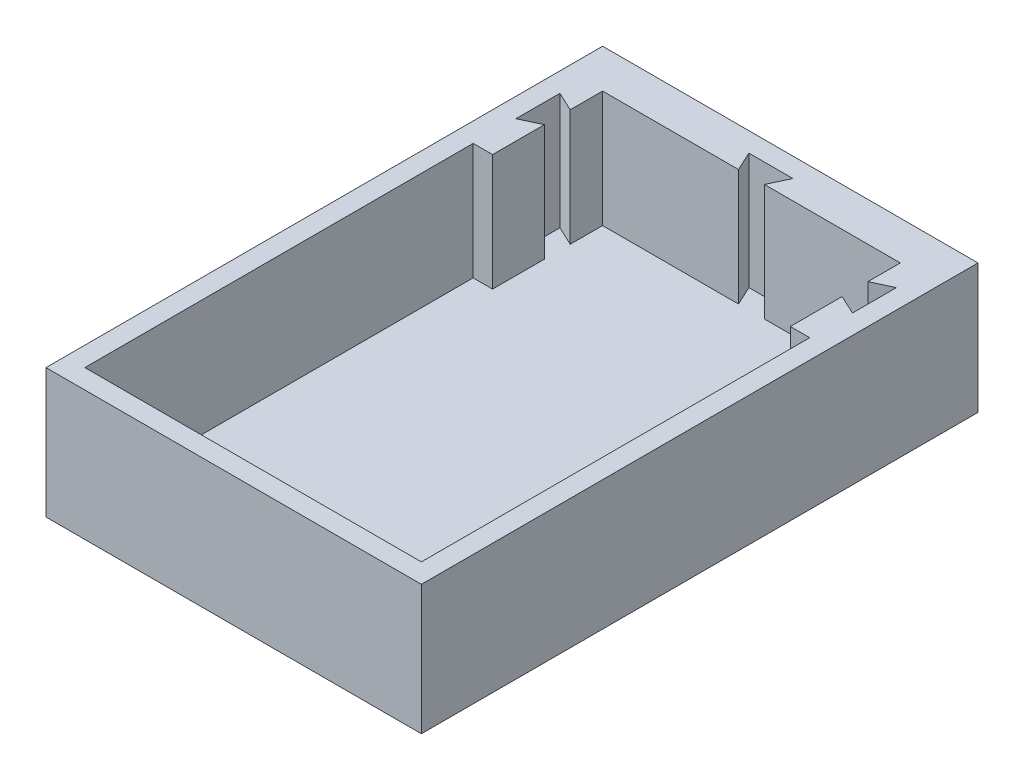
ISO-10303-21;
HEADER;
FILE_DESCRIPTION(('STEP AP214'),'2;1');
FILE_NAME('part.step','',(''),(''),'','','');
FILE_SCHEMA(('AUTOMOTIVE_DESIGN { 1 0 10303 214 1 1 1 1 }'));
ENDSEC;
DATA;
#1=APPLICATION_CONTEXT('core data for automotive mechanical design processes');
#2=APPLICATION_PROTOCOL_DEFINITION('international standard','automotive_design',2000,#1);
#3=PRODUCT_CONTEXT('',#1,'mechanical');
#4=PRODUCT('Part','Part','',(#3));
#5=PRODUCT_RELATED_PRODUCT_CATEGORY('part','',(#4));
#6=PRODUCT_DEFINITION_FORMATION('','',#4);
#7=PRODUCT_DEFINITION_CONTEXT('part definition',#1,'design');
#8=PRODUCT_DEFINITION('design','',#6,#7);
#9=PRODUCT_DEFINITION_SHAPE('','',#8);
#10=(LENGTH_UNIT() NAMED_UNIT(*) SI_UNIT(.MILLI.,.METRE.));
#11=(NAMED_UNIT(*) PLANE_ANGLE_UNIT() SI_UNIT($,.RADIAN.));
#12=(NAMED_UNIT(*) SI_UNIT($,.STERADIAN.) SOLID_ANGLE_UNIT());
#13=UNCERTAINTY_MEASURE_WITH_UNIT(LENGTH_MEASURE(1.E-05),#10,'distance_accuracy_value','');
#14=(GEOMETRIC_REPRESENTATION_CONTEXT(3) GLOBAL_UNCERTAINTY_ASSIGNED_CONTEXT((#13)) GLOBAL_UNIT_ASSIGNED_CONTEXT((#10,
#11,#12)) REPRESENTATION_CONTEXT('',''));
#15=CARTESIAN_POINT('',(0.,0.,0.));
#16=DIRECTION('',(0.,0.,1.));
#17=DIRECTION('',(1.,0.,0.));
#18=AXIS2_PLACEMENT_3D('',#15,#16,#17);
#19=CARTESIAN_POINT('',(66.04,25.4,0.));
#20=DIRECTION('',(1.,0.,0.));
#21=DIRECTION('',(0.,0.,-1.));
#22=AXIS2_PLACEMENT_3D('',#19,#20,#21);
#23=PLANE('',#22);
#24=DIRECTION('',(0.,0.,1.));
#25=VECTOR('',#24,1.);
#26=CARTESIAN_POINT('',(66.04,25.4,0.));
#27=LINE('',#26,#25);
#28=CARTESIAN_POINT('',(66.04,25.4,-76.2));
#29=VERTEX_POINT('',#28);
#30=CARTESIAN_POINT('',(66.04,25.4,0.));
#31=VERTEX_POINT('',#30);
#32=EDGE_CURVE('E223',#29,#31,#27,.T.);
#33=ORIENTED_EDGE('',*,*,#32,.F.);
#34=DIRECTION('',(0.,1.,0.));
#35=VECTOR('',#34,1.);
#36=CARTESIAN_POINT('',(66.04,-29.5887410273107,-76.2));
#37=LINE('',#36,#35);
#38=CARTESIAN_POINT('',(66.04,2.54,-76.2));
#39=VERTEX_POINT('',#38);
#40=EDGE_CURVE('E211',#39,#29,#37,.T.);
#41=ORIENTED_EDGE('',*,*,#40,.F.);
#42=DIRECTION('',(0.,0.,-1.));
#43=VECTOR('',#42,1.);
#44=CARTESIAN_POINT('',(66.04,2.54,0.));
#45=LINE('',#44,#43);
#46=CARTESIAN_POINT('',(66.04,2.54,0.));
#47=VERTEX_POINT('',#46);
#48=EDGE_CURVE('E54',#47,#39,#45,.T.);
#49=ORIENTED_EDGE('',*,*,#48,.F.);
#50=DIRECTION('',(0.,-1.,0.));
#51=VECTOR('',#50,1.);
#52=CARTESIAN_POINT('',(66.04,25.4,0.));
#53=LINE('',#52,#51);
#54=EDGE_CURVE('E286',#31,#47,#53,.T.);
#55=ORIENTED_EDGE('',*,*,#54,.F.);
#56=EDGE_LOOP('',(#33,#41,#49,#55));
#57=FACE_BOUND('',#56,.T.);
#58=ADVANCED_FACE('F45',(#57),#23,.F.);
#59=CARTESIAN_POINT('',(0.,25.4,0.));
#60=DIRECTION('',(-1.,0.,0.));
#61=DIRECTION('',(0.,0.,1.));
#62=AXIS2_PLACEMENT_3D('',#59,#60,#61);
#63=PLANE('',#62);
#64=DIRECTION('',(0.,0.,1.));
#65=VECTOR('',#64,1.);
#66=CARTESIAN_POINT('',(0.,2.54,0.));
#67=LINE('',#66,#65);
#68=CARTESIAN_POINT('',(0.,2.54,-93.2166321775705));
#69=VERTEX_POINT('',#68);
#70=CARTESIAN_POINT('',(0.,2.54,-84.5833678224295));
#71=VERTEX_POINT('',#70);
#72=EDGE_CURVE('E237',#69,#71,#67,.T.);
#73=ORIENTED_EDGE('',*,*,#72,.F.);
#74=DIRECTION('',(0.,1.,0.));
#75=VECTOR('',#74,1.);
#76=CARTESIAN_POINT('',(0.,-29.5887410273107,-93.2166321775705));
#77=LINE('',#76,#75);
#78=CARTESIAN_POINT('',(0.,25.4,-93.2166321775705));
#79=VERTEX_POINT('',#78);
#80=EDGE_CURVE('E349',#69,#79,#77,.T.);
#81=ORIENTED_EDGE('',*,*,#80,.T.);
#82=DIRECTION('',(0.,0.,-1.));
#83=VECTOR('',#82,1.);
#84=CARTESIAN_POINT('',(0.,25.4,0.));
#85=LINE('',#84,#83);
#86=CARTESIAN_POINT('',(0.,25.4,-84.5833678224295));
#87=VERTEX_POINT('',#86);
#88=EDGE_CURVE('E308',#87,#79,#85,.T.);
#89=ORIENTED_EDGE('',*,*,#88,.F.);
#90=DIRECTION('',(0.,1.,0.));
#91=VECTOR('',#90,1.);
#92=CARTESIAN_POINT('',(0.,-29.5887410273107,-84.5833678224295));
#93=LINE('',#92,#91);
#94=EDGE_CURVE('E313',#71,#87,#93,.T.);
#95=ORIENTED_EDGE('',*,*,#94,.F.);
#96=EDGE_LOOP('',(#73,#81,#89,#95));
#97=FACE_BOUND('',#96,.T.);
#98=ADVANCED_FACE('F510',(#97),#63,.F.);
#99=CARTESIAN_POINT('',(0.,2.54,0.));
#100=DIRECTION('',(0.,-1.,0.));
#101=DIRECTION('',(0.,0.,-1.));
#102=AXIS2_PLACEMENT_3D('',#99,#100,#101);
#103=PLANE('',#102);
#104=ORIENTED_EDGE('',*,*,#48,.T.);
#105=DIRECTION('',(1.,0.,0.));
#106=VECTOR('',#105,1.);
#107=CARTESIAN_POINT('',(0.,2.54,-76.2));
#108=LINE('',#107,#106);
#109=CARTESIAN_POINT('',(62.23,2.54,-76.2));
#110=VERTEX_POINT('',#109);
#111=EDGE_CURVE('E208',#110,#39,#108,.T.);
#112=ORIENTED_EDGE('',*,*,#111,.F.);
#113=DIRECTION('',(0.,0.,1.));
#114=VECTOR('',#113,1.);
#115=CARTESIAN_POINT('',(62.23,2.54,0.));
#116=LINE('',#115,#114);
#117=CARTESIAN_POINT('',(62.23,2.54,-86.36));
#118=VERTEX_POINT('',#117);
#119=EDGE_CURVE('E437',#118,#110,#116,.T.);
#120=ORIENTED_EDGE('',*,*,#119,.F.);
#121=DIRECTION('',(-0.906307787036654,0.,-0.422618261740691));
#122=VECTOR('',#121,1.);
#123=CARTESIAN_POINT('',(44.1924625784798,2.54,-94.771041833912));
#124=LINE('',#123,#122);
#125=CARTESIAN_POINT('',(66.04,2.54,-84.5833678224295));
#126=VERTEX_POINT('',#125);
#127=EDGE_CURVE('E442',#126,#118,#124,.T.);
#128=ORIENTED_EDGE('',*,*,#127,.F.);
#129=CARTESIAN_POINT('',(66.04,2.54,-93.2166321775705));
#130=VERTEX_POINT('',#129);
#131=EDGE_CURVE('E232',#126,#130,#45,.T.);
#132=ORIENTED_EDGE('',*,*,#131,.T.);
#133=DIRECTION('',(0.90630778703665,0.,-0.422618261740699));
#134=VECTOR('',#133,1.);
#135=CARTESIAN_POINT('',(-23.9088884147963,2.54,-51.2727766672216));
#136=LINE('',#135,#134);
#137=CARTESIAN_POINT('',(62.23,2.54,-91.44));
#138=VERTEX_POINT('',#137);
#139=EDGE_CURVE('E397',#138,#130,#136,.T.);
#140=ORIENTED_EDGE('',*,*,#139,.F.);
#141=DIRECTION('',(0.,0.,1.));
#142=VECTOR('',#141,1.);
#143=CARTESIAN_POINT('',(62.23,2.54,0.));
#144=LINE('',#143,#142);
#145=CARTESIAN_POINT('',(62.23,2.54,-97.79));
#146=VERTEX_POINT('',#145);
#147=EDGE_CURVE('E392',#146,#138,#144,.T.);
#148=ORIENTED_EDGE('',*,*,#147,.F.);
#149=DIRECTION('',(1.,0.,0.));
#150=VECTOR('',#149,1.);
#151=CARTESIAN_POINT('',(0.,2.54,-97.79));
#152=LINE('',#151,#150);
#153=CARTESIAN_POINT('',(35.56,2.54,-97.79));
#154=VERTEX_POINT('',#153);
#155=EDGE_CURVE('E405',#154,#146,#152,.T.);
#156=ORIENTED_EDGE('',*,*,#155,.F.);
#157=DIRECTION('',(-0.422618261740704,0.,0.906307787036648));
#158=VECTOR('',#157,1.);
#159=CARTESIAN_POINT('',(-8.24697934607616,2.54,-3.84562962572146));
#160=LINE('',#159,#158);
#161=CARTESIAN_POINT('',(37.3366321775706,2.54,-101.6));
#162=VERTEX_POINT('',#161);
#163=EDGE_CURVE('E401',#162,#154,#160,.T.);
#164=ORIENTED_EDGE('',*,*,#163,.F.);
#165=DIRECTION('',(-1.,0.,0.));
#166=VECTOR('',#165,1.);
#167=CARTESIAN_POINT('',(0.,2.54,-101.6));
#168=LINE('',#167,#166);
#169=CARTESIAN_POINT('',(28.7033678224294,2.54,-101.6));
#170=VERTEX_POINT('',#169);
#171=EDGE_CURVE('E11',#162,#170,#168,.T.);
#172=ORIENTED_EDGE('',*,*,#171,.T.);
#173=DIRECTION('',(-0.422618261740703,0.,-0.906307787036648));
#174=VECTOR('',#173,1.);
#175=CARTESIAN_POINT('',(62.4918262179254,2.54,-29.1404171375102));
#176=LINE('',#175,#174);
#177=CARTESIAN_POINT('',(30.48,2.54,-97.79));
#178=VERTEX_POINT('',#177);
#179=EDGE_CURVE('E350',#178,#170,#176,.T.);
#180=ORIENTED_EDGE('',*,*,#179,.F.);
#181=DIRECTION('',(1.,0.,0.));
#182=VECTOR('',#181,1.);
#183=CARTESIAN_POINT('',(0.,2.54,-97.79));
#184=LINE('',#183,#182);
#185=CARTESIAN_POINT('',(3.81000000000001,2.54,-97.79));
#186=VERTEX_POINT('',#185);
#187=EDGE_CURVE('E345',#186,#178,#184,.T.);
#188=ORIENTED_EDGE('',*,*,#187,.F.);
#189=DIRECTION('',(0.,0.,-1.));
#190=VECTOR('',#189,1.);
#191=CARTESIAN_POINT('',(3.80999999999998,2.54,0.));
#192=LINE('',#191,#190);
#193=CARTESIAN_POINT('',(3.80999999999999,2.54,-91.44));
#194=VERTEX_POINT('',#193);
#195=EDGE_CURVE('E358',#194,#186,#192,.T.);
#196=ORIENTED_EDGE('',*,*,#195,.F.);
#197=DIRECTION('',(0.906307787036653,0.,0.422618261740693));
#198=VECTOR('',#197,1.);
#199=CARTESIAN_POINT('',(35.7040415429464,2.54,-76.5675641790107));
#200=LINE('',#199,#198);
#201=EDGE_CURVE('E354',#69,#194,#200,.T.);
#202=ORIENTED_EDGE('',*,*,#201,.F.);
#203=ORIENTED_EDGE('',*,*,#72,.T.);
#204=DIRECTION('',(-0.906307787036651,0.,0.422618261740698));
#205=VECTOR('',#204,1.);
#206=CARTESIAN_POINT('',(-32.3973094503303,2.54,-69.4762543221232));
#207=LINE('',#206,#205);
#208=CARTESIAN_POINT('',(3.80999999999999,2.54,-86.36));
#209=VERTEX_POINT('',#208);
#210=EDGE_CURVE('E317',#209,#71,#207,.T.);
#211=ORIENTED_EDGE('',*,*,#210,.F.);
#212=DIRECTION('',(0.,0.,-1.));
#213=VECTOR('',#212,1.);
#214=CARTESIAN_POINT('',(3.81000000000001,2.54,0.));
#215=LINE('',#214,#213);
#216=CARTESIAN_POINT('',(3.81000000000001,2.54,-76.2));
#217=VERTEX_POINT('',#216);
#218=EDGE_CURVE('E312',#217,#209,#215,.T.);
#219=ORIENTED_EDGE('',*,*,#218,.F.);
#220=DIRECTION('',(1.,0.,0.));
#221=VECTOR('',#220,1.);
#222=CARTESIAN_POINT('',(0.,2.54,-76.2));
#223=LINE('',#222,#221);
#224=CARTESIAN_POINT('',(0.,2.54,-76.2));
#225=VERTEX_POINT('',#224);
#226=EDGE_CURVE('E321',#225,#217,#223,.T.);
#227=ORIENTED_EDGE('',*,*,#226,.F.);
#228=CARTESIAN_POINT('',(0.,2.54,0.));
#229=VERTEX_POINT('',#228);
#230=EDGE_CURVE('E240',#225,#229,#67,.T.);
#231=ORIENTED_EDGE('',*,*,#230,.T.);
#232=DIRECTION('',(1.,0.,0.));
#233=VECTOR('',#232,1.);
#234=CARTESIAN_POINT('',(0.,2.54,0.));
#235=LINE('',#234,#233);
#236=EDGE_CURVE('E230',#229,#47,#235,.T.);
#237=ORIENTED_EDGE('',*,*,#236,.T.);
#238=EDGE_LOOP('',(#104,#112,#120,#128,#132,#140,#148,#156,#164,#172,#180,#188,#196,#202,#203,
#211,#219,#227,#231,#237));
#239=FACE_BOUND('',#238,.T.);
#240=ADVANCED_FACE('F228',(#239),#103,.F.);
#241=ORIENTED_EDGE('',*,*,#230,.F.);
#242=DIRECTION('',(0.,1.,0.));
#243=VECTOR('',#242,1.);
#244=CARTESIAN_POINT('',(0.,-29.5887410273107,-76.2));
#245=LINE('',#244,#243);
#246=CARTESIAN_POINT('',(0.,25.4,-76.2));
#247=VERTEX_POINT('',#246);
#248=EDGE_CURVE('E316',#225,#247,#245,.T.);
#249=ORIENTED_EDGE('',*,*,#248,.T.);
#250=CARTESIAN_POINT('',(0.,25.4,0.));
#251=VERTEX_POINT('',#250);
#252=EDGE_CURVE('E304',#251,#247,#85,.T.);
#253=ORIENTED_EDGE('',*,*,#252,.F.);
#254=DIRECTION('',(0.,-1.,0.));
#255=VECTOR('',#254,1.);
#256=CARTESIAN_POINT('',(0.,25.4,0.));
#257=LINE('',#256,#255);
#258=EDGE_CURVE('E271',#251,#229,#257,.T.);
#259=ORIENTED_EDGE('',*,*,#258,.T.);
#260=EDGE_LOOP('',(#241,#249,#253,#259));
#261=FACE_BOUND('',#260,.T.);
#262=ADVANCED_FACE('F525',(#261),#63,.F.);
#263=CARTESIAN_POINT('',(0.,25.4,0.));
#264=DIRECTION('',(0.,0.,1.));
#265=DIRECTION('',(1.,0.,0.));
#266=AXIS2_PLACEMENT_3D('',#263,#264,#265);
#267=PLANE('',#266);
#268=ORIENTED_EDGE('',*,*,#54,.T.);
#269=ORIENTED_EDGE('',*,*,#236,.F.);
#270=ORIENTED_EDGE('',*,*,#258,.F.);
#271=DIRECTION('',(-1.,0.,0.));
#272=VECTOR('',#271,1.);
#273=CARTESIAN_POINT('',(0.,25.4,0.));
#274=LINE('',#273,#272);
#275=EDGE_CURVE('E289',#31,#251,#274,.T.);
#276=ORIENTED_EDGE('',*,*,#275,.F.);
#277=EDGE_LOOP('',(#268,#269,#270,#276));
#278=FACE_BOUND('',#277,.T.);
#279=ADVANCED_FACE('F528',(#278),#267,.F.);
#280=ORIENTED_EDGE('',*,*,#131,.F.);
#281=DIRECTION('',(0.,1.,0.));
#282=VECTOR('',#281,1.);
#283=CARTESIAN_POINT('',(66.04,-29.5887410273107,-84.5833678224295));
#284=LINE('',#283,#282);
#285=CARTESIAN_POINT('',(66.04,25.4,-84.5833678224295));
#286=VERTEX_POINT('',#285);
#287=EDGE_CURVE('E225',#126,#286,#284,.T.);
#288=ORIENTED_EDGE('',*,*,#287,.T.);
#289=CARTESIAN_POINT('',(66.04,25.4,-93.2166321775705));
#290=VERTEX_POINT('',#289);
#291=EDGE_CURVE('E296',#290,#286,#27,.T.);
#292=ORIENTED_EDGE('',*,*,#291,.F.);
#293=DIRECTION('',(0.,1.,0.));
#294=VECTOR('',#293,1.);
#295=CARTESIAN_POINT('',(66.04,-29.5887410273107,-93.2166321775705));
#296=LINE('',#295,#294);
#297=EDGE_CURVE('E393',#130,#290,#296,.T.);
#298=ORIENTED_EDGE('',*,*,#297,.F.);
#299=EDGE_LOOP('',(#280,#288,#292,#298));
#300=FACE_BOUND('',#299,.T.);
#301=ADVANCED_FACE('F467',(#300),#23,.F.);
#302=CARTESIAN_POINT('',(0.,25.4,-101.6));
#303=DIRECTION('',(0.,0.,-1.));
#304=DIRECTION('',(-1.,0.,0.));
#305=AXIS2_PLACEMENT_3D('',#302,#303,#304);
#306=PLANE('',#305);
#307=ORIENTED_EDGE('',*,*,#171,.F.);
#308=DIRECTION('',(0.,1.,0.));
#309=VECTOR('',#308,1.);
#310=CARTESIAN_POINT('',(37.3366321775706,-29.5887410273107,-101.6));
#311=LINE('',#310,#309);
#312=CARTESIAN_POINT('',(37.3366321775706,25.4,-101.6));
#313=VERTEX_POINT('',#312);
#314=EDGE_CURVE('E396',#162,#313,#311,.T.);
#315=ORIENTED_EDGE('',*,*,#314,.T.);
#316=DIRECTION('',(1.,0.,0.));
#317=VECTOR('',#316,1.);
#318=CARTESIAN_POINT('',(0.,25.4,-101.6));
#319=LINE('',#318,#317);
#320=CARTESIAN_POINT('',(28.7033678224294,25.4,-101.6));
#321=VERTEX_POINT('',#320);
#322=EDGE_CURVE('E300',#321,#313,#319,.T.);
#323=ORIENTED_EDGE('',*,*,#322,.F.);
#324=DIRECTION('',(0.,1.,0.));
#325=VECTOR('',#324,1.);
#326=CARTESIAN_POINT('',(28.7033678224294,-29.5887410273107,-101.6));
#327=LINE('',#326,#325);
#328=EDGE_CURVE('E346',#170,#321,#327,.T.);
#329=ORIENTED_EDGE('',*,*,#328,.F.);
#330=EDGE_LOOP('',(#307,#315,#323,#329));
#331=FACE_BOUND('',#330,.T.);
#332=ADVANCED_FACE('F488',(#331),#306,.F.);
#333=CARTESIAN_POINT('',(-3.81,25.4,3.81));
#334=DIRECTION('',(-1.,0.,0.));
#335=DIRECTION('',(0.,0.,1.));
#336=AXIS2_PLACEMENT_3D('',#333,#334,#335);
#337=PLANE('',#336);
#338=DIRECTION('',(0.,0.,-1.));
#339=VECTOR('',#338,1.);
#340=CARTESIAN_POINT('',(-3.81,0.,3.81));
#341=LINE('',#340,#339);
#342=CARTESIAN_POINT('',(-3.81,0.,3.81));
#343=VERTEX_POINT('',#342);
#344=CARTESIAN_POINT('',(-3.80999999999998,0.,-105.41));
#345=VERTEX_POINT('',#344);
#346=EDGE_CURVE('E267',#343,#345,#341,.T.);
#347=ORIENTED_EDGE('',*,*,#346,.F.);
#348=DIRECTION('',(0.,-1.,0.));
#349=VECTOR('',#348,1.);
#350=CARTESIAN_POINT('',(-3.81,25.4,3.81));
#351=LINE('',#350,#349);
#352=CARTESIAN_POINT('',(-3.81,25.4,3.81));
#353=VERTEX_POINT('',#352);
#354=EDGE_CURVE('E251',#353,#343,#351,.T.);
#355=ORIENTED_EDGE('',*,*,#354,.F.);
#356=DIRECTION('',(0.,0.,-1.));
#357=VECTOR('',#356,1.);
#358=CARTESIAN_POINT('',(-3.81,25.4,3.81));
#359=LINE('',#358,#357);
#360=CARTESIAN_POINT('',(-3.80999999999998,25.4,-105.41));
#361=VERTEX_POINT('',#360);
#362=EDGE_CURVE('E258',#353,#361,#359,.T.);
#363=ORIENTED_EDGE('',*,*,#362,.T.);
#364=DIRECTION('',(0.,-1.,0.));
#365=VECTOR('',#364,1.);
#366=CARTESIAN_POINT('',(-3.80999999999998,25.4,-105.41));
#367=LINE('',#366,#365);
#368=EDGE_CURVE('E241',#361,#345,#367,.T.);
#369=ORIENTED_EDGE('',*,*,#368,.T.);
#370=EDGE_LOOP('',(#347,#355,#363,#369));
#371=FACE_BOUND('',#370,.T.);
#372=ADVANCED_FACE('F544',(#371),#337,.T.);
#373=CARTESIAN_POINT('',(-3.81,25.4,3.81));
#374=DIRECTION('',(0.,0.,1.));
#375=DIRECTION('',(1.,0.,0.));
#376=AXIS2_PLACEMENT_3D('',#373,#374,#375);
#377=PLANE('',#376);
#378=DIRECTION('',(-1.,0.,0.));
#379=VECTOR('',#378,1.);
#380=CARTESIAN_POINT('',(-3.81,0.,3.81));
#381=LINE('',#380,#379);
#382=CARTESIAN_POINT('',(69.85,0.,3.81));
#383=VERTEX_POINT('',#382);
#384=EDGE_CURVE('E254',#383,#343,#381,.T.);
#385=ORIENTED_EDGE('',*,*,#384,.F.);
#386=DIRECTION('',(0.,-1.,0.));
#387=VECTOR('',#386,1.);
#388=CARTESIAN_POINT('',(69.85,25.4,3.81));
#389=LINE('',#388,#387);
#390=CARTESIAN_POINT('',(69.85,25.4,3.81));
#391=VERTEX_POINT('',#390);
#392=EDGE_CURVE('E248',#391,#383,#389,.T.);
#393=ORIENTED_EDGE('',*,*,#392,.F.);
#394=DIRECTION('',(-1.,0.,0.));
#395=VECTOR('',#394,1.);
#396=CARTESIAN_POINT('',(-3.81,25.4,3.81));
#397=LINE('',#396,#395);
#398=EDGE_CURVE('E245',#391,#353,#397,.T.);
#399=ORIENTED_EDGE('',*,*,#398,.T.);
#400=ORIENTED_EDGE('',*,*,#354,.T.);
#401=EDGE_LOOP('',(#385,#393,#399,#400));
#402=FACE_BOUND('',#401,.T.);
#403=ADVANCED_FACE('F549',(#402),#377,.T.);
#404=CARTESIAN_POINT('',(69.85,25.4,3.81));
#405=DIRECTION('',(1.,0.,0.));
#406=DIRECTION('',(0.,0.,-1.));
#407=AXIS2_PLACEMENT_3D('',#404,#405,#406);
#408=PLANE('',#407);
#409=DIRECTION('',(0.,0.,1.));
#410=VECTOR('',#409,1.);
#411=CARTESIAN_POINT('',(69.85,0.,3.81));
#412=LINE('',#411,#410);
#413=CARTESIAN_POINT('',(69.85,0.,-105.41));
#414=VERTEX_POINT('',#413);
#415=EDGE_CURVE('E259',#414,#383,#412,.T.);
#416=ORIENTED_EDGE('',*,*,#415,.F.);
#417=DIRECTION('',(0.,-1.,0.));
#418=VECTOR('',#417,1.);
#419=CARTESIAN_POINT('',(69.85,25.4,-105.41));
#420=LINE('',#419,#418);
#421=CARTESIAN_POINT('',(69.85,25.4,-105.41));
#422=VERTEX_POINT('',#421);
#423=EDGE_CURVE('E244',#422,#414,#420,.T.);
#424=ORIENTED_EDGE('',*,*,#423,.F.);
#425=DIRECTION('',(0.,0.,1.));
#426=VECTOR('',#425,1.);
#427=CARTESIAN_POINT('',(69.85,25.4,3.81));
#428=LINE('',#427,#426);
#429=EDGE_CURVE('E275',#422,#391,#428,.T.);
#430=ORIENTED_EDGE('',*,*,#429,.T.);
#431=ORIENTED_EDGE('',*,*,#392,.T.);
#432=EDGE_LOOP('',(#416,#424,#430,#431));
#433=FACE_BOUND('',#432,.T.);
#434=ADVANCED_FACE('F552',(#433),#408,.T.);
#435=CARTESIAN_POINT('',(-3.80999999999998,25.4,-105.41));
#436=DIRECTION('',(0.,0.,-1.));
#437=DIRECTION('',(-1.,0.,0.));
#438=AXIS2_PLACEMENT_3D('',#435,#436,#437);
#439=PLANE('',#438);
#440=DIRECTION('',(1.,0.,0.));
#441=VECTOR('',#440,1.);
#442=CARTESIAN_POINT('',(-3.80999999999998,0.,-105.41));
#443=LINE('',#442,#441);
#444=EDGE_CURVE('E263',#345,#414,#443,.T.);
#445=ORIENTED_EDGE('',*,*,#444,.F.);
#446=ORIENTED_EDGE('',*,*,#368,.F.);
#447=DIRECTION('',(1.,0.,0.));
#448=VECTOR('',#447,1.);
#449=CARTESIAN_POINT('',(-3.80999999999998,25.4,-105.41));
#450=LINE('',#449,#448);
#451=EDGE_CURVE('E279',#361,#422,#450,.T.);
#452=ORIENTED_EDGE('',*,*,#451,.T.);
#453=ORIENTED_EDGE('',*,*,#423,.T.);
#454=EDGE_LOOP('',(#445,#446,#452,#453));
#455=FACE_BOUND('',#454,.T.);
#456=ADVANCED_FACE('F548',(#455),#439,.T.);
#457=CARTESIAN_POINT('',(0.,25.4,0.));
#458=DIRECTION('',(0.,-1.,0.));
#459=DIRECTION('',(0.,0.,-1.));
#460=AXIS2_PLACEMENT_3D('',#457,#458,#459);
#461=PLANE('',#460);
#462=DIRECTION('',(0.90630778703665,0.,-0.422618261740699));
#463=VECTOR('',#462,1.);
#464=CARTESIAN_POINT('',(-23.9088884147963,25.4,-51.2727766672216));
#465=LINE('',#464,#463);
#466=CARTESIAN_POINT('',(62.23,25.4,-91.44));
#467=VERTEX_POINT('',#466);
#468=EDGE_CURVE('E425',#467,#290,#465,.T.);
#469=ORIENTED_EDGE('',*,*,#468,.T.);
#470=ORIENTED_EDGE('',*,*,#291,.T.);
#471=DIRECTION('',(-0.906307787036654,0.,-0.422618261740691));
#472=VECTOR('',#471,1.);
#473=CARTESIAN_POINT('',(44.1924625784798,25.4,-94.771041833912));
#474=LINE('',#473,#472);
#475=CARTESIAN_POINT('',(62.23,25.4,-86.36));
#476=VERTEX_POINT('',#475);
#477=EDGE_CURVE('E218',#286,#476,#474,.T.);
#478=ORIENTED_EDGE('',*,*,#477,.T.);
#479=DIRECTION('',(0.,0.,1.));
#480=VECTOR('',#479,1.);
#481=CARTESIAN_POINT('',(62.23,25.4,0.));
#482=LINE('',#481,#480);
#483=CARTESIAN_POINT('',(62.23,25.4,-76.2));
#484=VERTEX_POINT('',#483);
#485=EDGE_CURVE('E451',#476,#484,#482,.T.);
#486=ORIENTED_EDGE('',*,*,#485,.T.);
#487=DIRECTION('',(1.,0.,0.));
#488=VECTOR('',#487,1.);
#489=CARTESIAN_POINT('',(0.,25.4,-76.2));
#490=LINE('',#489,#488);
#491=EDGE_CURVE('E61',#484,#29,#490,.T.);
#492=ORIENTED_EDGE('',*,*,#491,.T.);
#493=ORIENTED_EDGE('',*,*,#32,.T.);
#494=ORIENTED_EDGE('',*,*,#275,.T.);
#495=ORIENTED_EDGE('',*,*,#252,.T.);
#496=DIRECTION('',(1.,0.,0.));
#497=VECTOR('',#496,1.);
#498=CARTESIAN_POINT('',(0.,25.4,-76.2));
#499=LINE('',#498,#497);
#500=CARTESIAN_POINT('',(3.81000000000001,25.4,-76.2));
#501=VERTEX_POINT('',#500);
#502=EDGE_CURVE('E333',#247,#501,#499,.T.);
#503=ORIENTED_EDGE('',*,*,#502,.T.);
#504=DIRECTION('',(0.,0.,-1.));
#505=VECTOR('',#504,1.);
#506=CARTESIAN_POINT('',(3.81000000000001,25.4,0.));
#507=LINE('',#506,#505);
#508=CARTESIAN_POINT('',(3.81000000000001,25.4,-86.36));
#509=VERTEX_POINT('',#508);
#510=EDGE_CURVE('E334',#501,#509,#507,.T.);
#511=ORIENTED_EDGE('',*,*,#510,.T.);
#512=DIRECTION('',(-0.90630778703665,0.,0.422618261740698));
#513=VECTOR('',#512,1.);
#514=CARTESIAN_POINT('',(-32.3973094503303,25.4,-69.4762543221232));
#515=LINE('',#514,#513);
#516=EDGE_CURVE('E68',#509,#87,#515,.T.);
#517=ORIENTED_EDGE('',*,*,#516,.T.);
#518=ORIENTED_EDGE('',*,*,#88,.T.);
#519=DIRECTION('',(0.906307787036653,0.,0.422618261740693));
#520=VECTOR('',#519,1.);
#521=CARTESIAN_POINT('',(35.7040415429464,25.4,-76.5675641790107));
#522=LINE('',#521,#520);
#523=CARTESIAN_POINT('',(3.81,25.4,-91.44));
#524=VERTEX_POINT('',#523);
#525=EDGE_CURVE('E383',#79,#524,#522,.T.);
#526=ORIENTED_EDGE('',*,*,#525,.T.);
#527=DIRECTION('',(0.,0.,-1.));
#528=VECTOR('',#527,1.);
#529=CARTESIAN_POINT('',(3.80999999999998,25.4,0.));
#530=LINE('',#529,#528);
#531=CARTESIAN_POINT('',(3.81000000000001,25.4,-97.79));
#532=VERTEX_POINT('',#531);
#533=EDGE_CURVE('E373',#524,#532,#530,.T.);
#534=ORIENTED_EDGE('',*,*,#533,.T.);
#535=DIRECTION('',(1.,0.,0.));
#536=VECTOR('',#535,1.);
#537=CARTESIAN_POINT('',(0.,25.4,-97.79));
#538=LINE('',#537,#536);
#539=CARTESIAN_POINT('',(30.48,25.4,-97.79));
#540=VERTEX_POINT('',#539);
#541=EDGE_CURVE('E374',#532,#540,#538,.T.);
#542=ORIENTED_EDGE('',*,*,#541,.T.);
#543=DIRECTION('',(-0.422618261740703,0.,-0.906307787036648));
#544=VECTOR('',#543,1.);
#545=CARTESIAN_POINT('',(62.4918262179254,25.4,-29.1404171375102));
#546=LINE('',#545,#544);
#547=EDGE_CURVE('E378',#540,#321,#546,.T.);
#548=ORIENTED_EDGE('',*,*,#547,.T.);
#549=ORIENTED_EDGE('',*,*,#322,.T.);
#550=DIRECTION('',(-0.422618261740703,0.,0.906307787036648));
#551=VECTOR('',#550,1.);
#552=CARTESIAN_POINT('',(-8.24697934607616,25.4,-3.84562962572146));
#553=LINE('',#552,#551);
#554=CARTESIAN_POINT('',(35.56,25.4,-97.79));
#555=VERTEX_POINT('',#554);
#556=EDGE_CURVE('E429',#313,#555,#553,.T.);
#557=ORIENTED_EDGE('',*,*,#556,.T.);
#558=DIRECTION('',(1.,0.,0.));
#559=VECTOR('',#558,1.);
#560=CARTESIAN_POINT('',(0.,25.4,-97.79));
#561=LINE('',#560,#559);
#562=CARTESIAN_POINT('',(62.23,25.4,-97.79));
#563=VERTEX_POINT('',#562);
#564=EDGE_CURVE('E420',#555,#563,#561,.T.);
#565=ORIENTED_EDGE('',*,*,#564,.T.);
#566=DIRECTION('',(0.,0.,1.));
#567=VECTOR('',#566,1.);
#568=CARTESIAN_POINT('',(62.23,25.4,0.));
#569=LINE('',#568,#567);
#570=EDGE_CURVE('E421',#563,#467,#569,.T.);
#571=ORIENTED_EDGE('',*,*,#570,.T.);
#572=EDGE_LOOP('',(#469,#470,#478,#486,#492,#493,#494,#495,#503,#511,#517,#518,#526,#534,#542,
#548,#549,#557,#565,#571));
#573=FACE_BOUND('',#572,.T.);
#574=ORIENTED_EDGE('',*,*,#362,.F.);
#575=ORIENTED_EDGE('',*,*,#398,.F.);
#576=ORIENTED_EDGE('',*,*,#429,.F.);
#577=ORIENTED_EDGE('',*,*,#451,.F.);
#578=EDGE_LOOP('',(#574,#575,#576,#577));
#579=FACE_BOUND('',#578,.T.);
#580=ADVANCED_FACE('F458',(#573,#579),#461,.F.);
#581=CARTESIAN_POINT('',(0.,0.,0.));
#582=DIRECTION('',(0.,-1.,0.));
#583=DIRECTION('',(0.,0.,-1.));
#584=AXIS2_PLACEMENT_3D('',#581,#582,#583);
#585=PLANE('',#584);
#586=ORIENTED_EDGE('',*,*,#346,.T.);
#587=ORIENTED_EDGE('',*,*,#444,.T.);
#588=ORIENTED_EDGE('',*,*,#415,.T.);
#589=ORIENTED_EDGE('',*,*,#384,.T.);
#590=EDGE_LOOP('',(#586,#587,#588,#589));
#591=FACE_BOUND('',#590,.T.);
#592=ADVANCED_FACE('F47',(#591),#585,.T.);
#593=CARTESIAN_POINT('',(-32.3973094503303,-29.5887410273107,-69.4762543221232));
#594=DIRECTION('',(-0.422618261740698,0.,-0.906307787036651));
#595=DIRECTION('',(-0.906307787036651,0.,0.422618261740698));
#596=AXIS2_PLACEMENT_3D('',#593,#594,#595);
#597=PLANE('',#596);
#598=DIRECTION('',(0.,1.,0.));
#599=VECTOR('',#598,1.);
#600=CARTESIAN_POINT('',(3.81000000000001,-29.5887410273107,-86.36));
#601=LINE('',#600,#599);
#602=EDGE_CURVE('E309',#209,#509,#601,.T.);
#603=ORIENTED_EDGE('',*,*,#602,.F.);
#604=ORIENTED_EDGE('',*,*,#210,.T.);
#605=ORIENTED_EDGE('',*,*,#94,.T.);
#606=ORIENTED_EDGE('',*,*,#516,.F.);
#607=EDGE_LOOP('',(#603,#604,#605,#606));
#608=FACE_BOUND('',#607,.T.);
#609=ADVANCED_FACE('F514',(#608),#597,.T.);
#610=CARTESIAN_POINT('',(0.,-29.5887410273107,-76.2));
#611=DIRECTION('',(0.,0.,1.));
#612=DIRECTION('',(1.,0.,0.));
#613=AXIS2_PLACEMENT_3D('',#610,#611,#612);
#614=PLANE('',#613);
#615=ORIENTED_EDGE('',*,*,#248,.F.);
#616=ORIENTED_EDGE('',*,*,#226,.T.);
#617=DIRECTION('',(0.,1.,0.));
#618=VECTOR('',#617,1.);
#619=CARTESIAN_POINT('',(3.81000000000001,-29.5887410273107,-76.2));
#620=LINE('',#619,#618);
#621=EDGE_CURVE('E322',#217,#501,#620,.T.);
#622=ORIENTED_EDGE('',*,*,#621,.T.);
#623=ORIENTED_EDGE('',*,*,#502,.F.);
#624=EDGE_LOOP('',(#615,#616,#622,#623));
#625=FACE_BOUND('',#624,.T.);
#626=ADVANCED_FACE('F522',(#625),#614,.T.);
#627=CARTESIAN_POINT('',(3.81000000000001,-29.5887410273107,0.));
#628=DIRECTION('',(1.,0.,0.));
#629=DIRECTION('',(0.,0.,-1.));
#630=AXIS2_PLACEMENT_3D('',#627,#628,#629);
#631=PLANE('',#630);
#632=ORIENTED_EDGE('',*,*,#621,.F.);
#633=ORIENTED_EDGE('',*,*,#218,.T.);
#634=ORIENTED_EDGE('',*,*,#602,.T.);
#635=ORIENTED_EDGE('',*,*,#510,.F.);
#636=EDGE_LOOP('',(#632,#633,#634,#635));
#637=FACE_BOUND('',#636,.T.);
#638=ADVANCED_FACE('F519',(#637),#631,.T.);
#639=CARTESIAN_POINT('',(62.4918262179254,-29.5887410273107,-29.1404171375102));
#640=DIRECTION('',(0.906307787036648,0.,-0.422618261740703));
#641=DIRECTION('',(-0.422618261740703,0.,-0.906307787036648));
#642=AXIS2_PLACEMENT_3D('',#639,#640,#641);
#643=PLANE('',#642);
#644=DIRECTION('',(0.,1.,0.));
#645=VECTOR('',#644,1.);
#646=CARTESIAN_POINT('',(30.48,-29.5887410273107,-97.79));
#647=LINE('',#646,#645);
#648=EDGE_CURVE('E337',#178,#540,#647,.T.);
#649=ORIENTED_EDGE('',*,*,#648,.F.);
#650=ORIENTED_EDGE('',*,*,#179,.T.);
#651=ORIENTED_EDGE('',*,*,#328,.T.);
#652=ORIENTED_EDGE('',*,*,#547,.F.);
#653=EDGE_LOOP('',(#649,#650,#651,#652));
#654=FACE_BOUND('',#653,.T.);
#655=ADVANCED_FACE('F494',(#654),#643,.T.);
#656=CARTESIAN_POINT('',(35.7040415429464,-29.5887410273107,-76.5675641790107));
#657=DIRECTION('',(-0.422618261740693,0.,0.906307787036653));
#658=DIRECTION('',(0.906307787036653,0.,0.422618261740693));
#659=AXIS2_PLACEMENT_3D('',#656,#657,#658);
#660=PLANE('',#659);
#661=ORIENTED_EDGE('',*,*,#80,.F.);
#662=ORIENTED_EDGE('',*,*,#201,.T.);
#663=DIRECTION('',(0.,1.,0.));
#664=VECTOR('',#663,1.);
#665=CARTESIAN_POINT('',(3.81,-29.5887410273107,-91.44));
#666=LINE('',#665,#664);
#667=EDGE_CURVE('E355',#194,#524,#666,.T.);
#668=ORIENTED_EDGE('',*,*,#667,.T.);
#669=ORIENTED_EDGE('',*,*,#525,.F.);
#670=EDGE_LOOP('',(#661,#662,#668,#669));
#671=FACE_BOUND('',#670,.T.);
#672=ADVANCED_FACE('F505',(#671),#660,.T.);
#673=CARTESIAN_POINT('',(3.80999999999998,-29.5887410273107,0.));
#674=DIRECTION('',(1.,0.,0.));
#675=DIRECTION('',(0.,0.,-1.));
#676=AXIS2_PLACEMENT_3D('',#673,#674,#675);
#677=PLANE('',#676);
#678=ORIENTED_EDGE('',*,*,#667,.F.);
#679=ORIENTED_EDGE('',*,*,#195,.T.);
#680=DIRECTION('',(0.,1.,0.));
#681=VECTOR('',#680,1.);
#682=CARTESIAN_POINT('',(3.81000000000001,-29.5887410273107,-97.79));
#683=LINE('',#682,#681);
#684=EDGE_CURVE('E359',#186,#532,#683,.T.);
#685=ORIENTED_EDGE('',*,*,#684,.T.);
#686=ORIENTED_EDGE('',*,*,#533,.F.);
#687=EDGE_LOOP('',(#678,#679,#685,#686));
#688=FACE_BOUND('',#687,.T.);
#689=ADVANCED_FACE('F503',(#688),#677,.T.);
#690=CARTESIAN_POINT('',(0.,-29.5887410273107,-97.79));
#691=DIRECTION('',(0.,0.,1.));
#692=DIRECTION('',(1.,0.,0.));
#693=AXIS2_PLACEMENT_3D('',#690,#691,#692);
#694=PLANE('',#693);
#695=ORIENTED_EDGE('',*,*,#684,.F.);
#696=ORIENTED_EDGE('',*,*,#187,.T.);
#697=ORIENTED_EDGE('',*,*,#648,.T.);
#698=ORIENTED_EDGE('',*,*,#541,.F.);
#699=EDGE_LOOP('',(#695,#696,#697,#698));
#700=FACE_BOUND('',#699,.T.);
#701=ADVANCED_FACE('F500',(#700),#694,.T.);
#702=CARTESIAN_POINT('',(-23.9088884147963,-29.5887410273107,-51.2727766672216));
#703=DIRECTION('',(0.422618261740699,0.,0.90630778703665));
#704=DIRECTION('',(0.90630778703665,0.,-0.422618261740699));
#705=AXIS2_PLACEMENT_3D('',#702,#703,#704);
#706=PLANE('',#705);
#707=DIRECTION('',(0.,1.,0.));
#708=VECTOR('',#707,1.);
#709=CARTESIAN_POINT('',(62.23,-29.5887410273107,-91.44));
#710=LINE('',#709,#708);
#711=EDGE_CURVE('E379',#138,#467,#710,.T.);
#712=ORIENTED_EDGE('',*,*,#711,.F.);
#713=ORIENTED_EDGE('',*,*,#139,.T.);
#714=ORIENTED_EDGE('',*,*,#297,.T.);
#715=ORIENTED_EDGE('',*,*,#468,.F.);
#716=EDGE_LOOP('',(#712,#713,#714,#715));
#717=FACE_BOUND('',#716,.T.);
#718=ADVANCED_FACE('F473',(#717),#706,.T.);
#719=CARTESIAN_POINT('',(-8.24697934607616,-29.5887410273107,-3.84562962572146));
#720=DIRECTION('',(-0.906307787036648,0.,-0.422618261740704));
#721=DIRECTION('',(-0.422618261740704,0.,0.906307787036648));
#722=AXIS2_PLACEMENT_3D('',#719,#720,#721);
#723=PLANE('',#722);
#724=ORIENTED_EDGE('',*,*,#314,.F.);
#725=ORIENTED_EDGE('',*,*,#163,.T.);
#726=DIRECTION('',(0.,1.,0.));
#727=VECTOR('',#726,1.);
#728=CARTESIAN_POINT('',(35.56,-29.5887410273107,-97.79));
#729=LINE('',#728,#727);
#730=EDGE_CURVE('E402',#154,#555,#729,.T.);
#731=ORIENTED_EDGE('',*,*,#730,.T.);
#732=ORIENTED_EDGE('',*,*,#556,.F.);
#733=EDGE_LOOP('',(#724,#725,#731,#732));
#734=FACE_BOUND('',#733,.T.);
#735=ADVANCED_FACE('F485',(#734),#723,.T.);
#736=CARTESIAN_POINT('',(0.,-29.5887410273107,-97.79));
#737=DIRECTION('',(0.,0.,1.));
#738=DIRECTION('',(1.,0.,0.));
#739=AXIS2_PLACEMENT_3D('',#736,#737,#738);
#740=PLANE('',#739);
#741=ORIENTED_EDGE('',*,*,#730,.F.);
#742=ORIENTED_EDGE('',*,*,#155,.T.);
#743=DIRECTION('',(0.,1.,0.));
#744=VECTOR('',#743,1.);
#745=CARTESIAN_POINT('',(62.23,-29.5887410273107,-97.79));
#746=LINE('',#745,#744);
#747=EDGE_CURVE('E406',#146,#563,#746,.T.);
#748=ORIENTED_EDGE('',*,*,#747,.T.);
#749=ORIENTED_EDGE('',*,*,#564,.F.);
#750=EDGE_LOOP('',(#741,#742,#748,#749));
#751=FACE_BOUND('',#750,.T.);
#752=ADVANCED_FACE('F482',(#751),#740,.T.);
#753=CARTESIAN_POINT('',(62.23,-29.5887410273107,0.));
#754=DIRECTION('',(-1.,0.,0.));
#755=DIRECTION('',(0.,0.,1.));
#756=AXIS2_PLACEMENT_3D('',#753,#754,#755);
#757=PLANE('',#756);
#758=ORIENTED_EDGE('',*,*,#747,.F.);
#759=ORIENTED_EDGE('',*,*,#147,.T.);
#760=ORIENTED_EDGE('',*,*,#711,.T.);
#761=ORIENTED_EDGE('',*,*,#570,.F.);
#762=EDGE_LOOP('',(#758,#759,#760,#761));
#763=FACE_BOUND('',#762,.T.);
#764=ADVANCED_FACE('F477',(#763),#757,.T.);
#765=CARTESIAN_POINT('',(0.,-29.5887410273107,-76.2));
#766=DIRECTION('',(0.,0.,1.));
#767=DIRECTION('',(1.,0.,0.));
#768=AXIS2_PLACEMENT_3D('',#765,#766,#767);
#769=PLANE('',#768);
#770=DIRECTION('',(0.,1.,0.));
#771=VECTOR('',#770,1.);
#772=CARTESIAN_POINT('',(62.23,-29.5887410273107,-76.2));
#773=LINE('',#772,#771);
#774=EDGE_CURVE('E213',#110,#484,#773,.T.);
#775=ORIENTED_EDGE('',*,*,#774,.F.);
#776=ORIENTED_EDGE('',*,*,#111,.T.);
#777=ORIENTED_EDGE('',*,*,#40,.T.);
#778=ORIENTED_EDGE('',*,*,#491,.F.);
#779=EDGE_LOOP('',(#775,#776,#777,#778));
#780=FACE_BOUND('',#779,.T.);
#781=ADVANCED_FACE('F210',(#780),#769,.T.);
#782=CARTESIAN_POINT('',(44.1924625784798,-29.5887410273107,-94.771041833912));
#783=DIRECTION('',(0.422618261740691,0.,-0.906307787036654));
#784=DIRECTION('',(-0.906307787036654,0.,-0.422618261740691));
#785=AXIS2_PLACEMENT_3D('',#782,#783,#784);
#786=PLANE('',#785);
#787=ORIENTED_EDGE('',*,*,#287,.F.);
#788=ORIENTED_EDGE('',*,*,#127,.T.);
#789=DIRECTION('',(0.,1.,0.));
#790=VECTOR('',#789,1.);
#791=CARTESIAN_POINT('',(62.23,-29.5887410273107,-86.36));
#792=LINE('',#791,#790);
#793=EDGE_CURVE('E443',#118,#476,#792,.T.);
#794=ORIENTED_EDGE('',*,*,#793,.T.);
#795=ORIENTED_EDGE('',*,*,#477,.F.);
#796=EDGE_LOOP('',(#787,#788,#794,#795));
#797=FACE_BOUND('',#796,.T.);
#798=ADVANCED_FACE('F463',(#797),#786,.T.);
#799=CARTESIAN_POINT('',(62.23,-29.5887410273107,0.));
#800=DIRECTION('',(-1.,0.,0.));
#801=DIRECTION('',(0.,0.,1.));
#802=AXIS2_PLACEMENT_3D('',#799,#800,#801);
#803=PLANE('',#802);
#804=ORIENTED_EDGE('',*,*,#793,.F.);
#805=ORIENTED_EDGE('',*,*,#119,.T.);
#806=ORIENTED_EDGE('',*,*,#774,.T.);
#807=ORIENTED_EDGE('',*,*,#485,.F.);
#808=EDGE_LOOP('',(#804,#805,#806,#807));
#809=FACE_BOUND('',#808,.T.);
#810=ADVANCED_FACE('F713',(#809),#803,.T.);
#811=CLOSED_SHELL('',(#58,#98,#240,#262,#279,#301,#332,#372,#403,#434,#456,#580,#592,#609,#626,
#638,#655,#672,#689,#701,#718,#735,#752,#764,#781,#798,#810));
#812=MANIFOLD_SOLID_BREP('B2',#811);
#813=ADVANCED_BREP_SHAPE_REPRESENTATION('',(#18,#812),#14);
#814=SHAPE_DEFINITION_REPRESENTATION(#9,#813);
ENDSEC;
END-ISO-10303-21;
